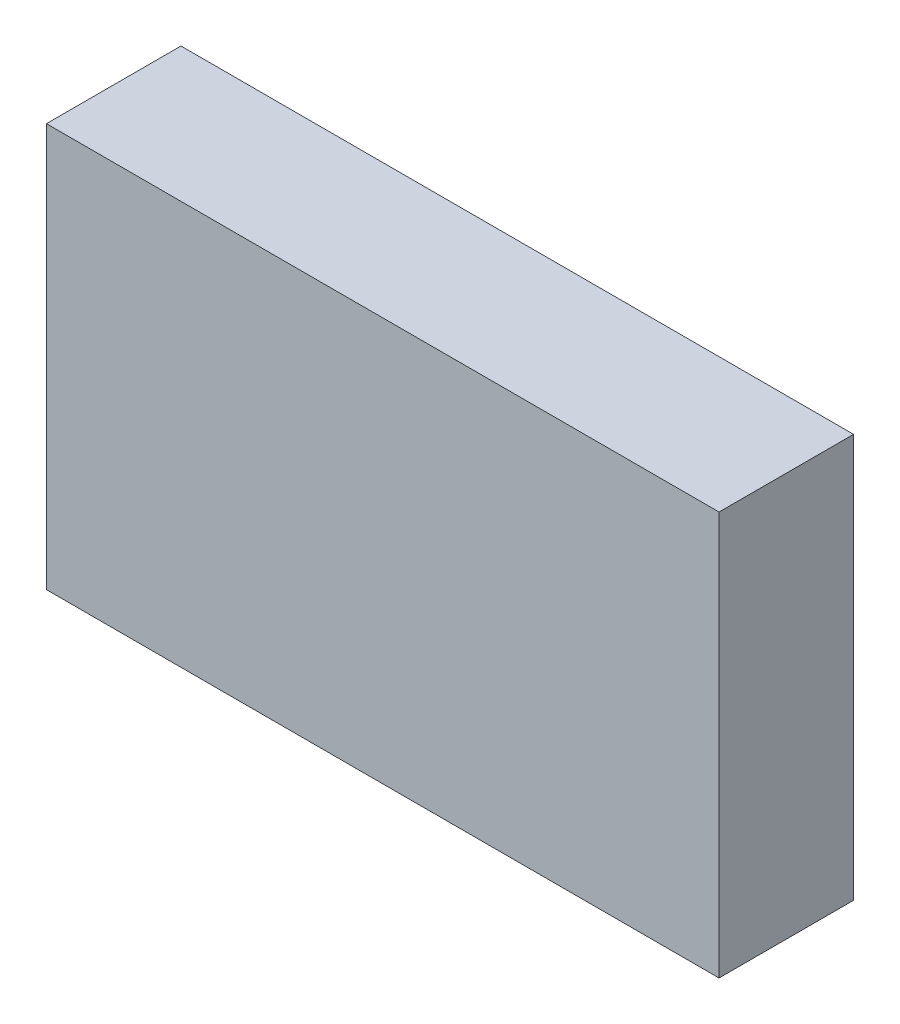
ISO-10303-21;
HEADER;
FILE_DESCRIPTION(('STEP AP214'),'2;1');
FILE_NAME('part.step','',(''),(''),'','','');
FILE_SCHEMA(('AUTOMOTIVE_DESIGN { 1 0 10303 214 1 1 1 1 }'));
ENDSEC;
DATA;
#1=APPLICATION_CONTEXT('core data for automotive mechanical design processes');
#2=APPLICATION_PROTOCOL_DEFINITION('international standard','automotive_design',2000,#1);
#3=PRODUCT_CONTEXT('',#1,'mechanical');
#4=PRODUCT('Part','Part','',(#3));
#5=PRODUCT_RELATED_PRODUCT_CATEGORY('part','',(#4));
#6=PRODUCT_DEFINITION_FORMATION('','',#4);
#7=PRODUCT_DEFINITION_CONTEXT('part definition',#1,'design');
#8=PRODUCT_DEFINITION('design','',#6,#7);
#9=PRODUCT_DEFINITION_SHAPE('','',#8);
#10=(LENGTH_UNIT() NAMED_UNIT(*) SI_UNIT(.MILLI.,.METRE.));
#11=(NAMED_UNIT(*) PLANE_ANGLE_UNIT() SI_UNIT($,.RADIAN.));
#12=(NAMED_UNIT(*) SI_UNIT($,.STERADIAN.) SOLID_ANGLE_UNIT());
#13=UNCERTAINTY_MEASURE_WITH_UNIT(LENGTH_MEASURE(1.E-05),#10,'distance_accuracy_value','');
#14=(GEOMETRIC_REPRESENTATION_CONTEXT(3) GLOBAL_UNCERTAINTY_ASSIGNED_CONTEXT((#13)) GLOBAL_UNIT_ASSIGNED_CONTEXT((#10,
#11,#12)) REPRESENTATION_CONTEXT('',''));
#15=CARTESIAN_POINT('',(0.,0.,0.));
#16=DIRECTION('',(0.,0.,1.));
#17=DIRECTION('',(1.,0.,0.));
#18=AXIS2_PLACEMENT_3D('',#15,#16,#17);
#19=CARTESIAN_POINT('',(0.,0.,20.));
#20=DIRECTION('',(1.,0.,0.));
#21=DIRECTION('',(0.,0.,-1.));
#22=AXIS2_PLACEMENT_3D('',#19,#20,#21);
#23=PLANE('',#22);
#24=DIRECTION('',(0.,-1.,0.));
#25=VECTOR('',#24,1.);
#26=CARTESIAN_POINT('',(0.,0.,0.));
#27=LINE('',#26,#25);
#28=CARTESIAN_POINT('',(0.,60.,0.));
#29=VERTEX_POINT('',#28);
#30=CARTESIAN_POINT('',(0.,0.,0.));
#31=VERTEX_POINT('',#30);
#32=EDGE_CURVE('E105',#29,#31,#27,.T.);
#33=ORIENTED_EDGE('',*,*,#32,.T.);
#34=DIRECTION('',(0.,0.,-1.));
#35=VECTOR('',#34,1.);
#36=CARTESIAN_POINT('',(0.,0.,20.));
#37=LINE('',#36,#35);
#38=CARTESIAN_POINT('',(0.,0.,20.));
#39=VERTEX_POINT('',#38);
#40=EDGE_CURVE('E11',#39,#31,#37,.T.);
#41=ORIENTED_EDGE('',*,*,#40,.F.);
#42=DIRECTION('',(0.,-1.,0.));
#43=VECTOR('',#42,1.);
#44=CARTESIAN_POINT('',(0.,0.,20.));
#45=LINE('',#44,#43);
#46=CARTESIAN_POINT('',(0.,60.,20.));
#47=VERTEX_POINT('',#46);
#48=EDGE_CURVE('E89',#47,#39,#45,.T.);
#49=ORIENTED_EDGE('',*,*,#48,.F.);
#50=DIRECTION('',(0.,0.,-1.));
#51=VECTOR('',#50,1.);
#52=CARTESIAN_POINT('',(0.,60.,20.));
#53=LINE('',#52,#51);
#54=EDGE_CURVE('E97',#47,#29,#53,.T.);
#55=ORIENTED_EDGE('',*,*,#54,.T.);
#56=EDGE_LOOP('',(#33,#41,#49,#55));
#57=FACE_BOUND('',#56,.T.);
#58=ADVANCED_FACE('F39',(#57),#23,.F.);
#59=CARTESIAN_POINT('',(0.,0.,20.));
#60=DIRECTION('',(0.,1.,0.));
#61=DIRECTION('',(0.,0.,1.));
#62=AXIS2_PLACEMENT_3D('',#59,#60,#61);
#63=PLANE('',#62);
#64=DIRECTION('',(1.,0.,0.));
#65=VECTOR('',#64,1.);
#66=CARTESIAN_POINT('',(0.,0.,0.));
#67=LINE('',#66,#65);
#68=CARTESIAN_POINT('',(100.,0.,0.));
#69=VERTEX_POINT('',#68);
#70=EDGE_CURVE('E92',#31,#69,#67,.T.);
#71=ORIENTED_EDGE('',*,*,#70,.T.);
#72=DIRECTION('',(0.,0.,-1.));
#73=VECTOR('',#72,1.);
#74=CARTESIAN_POINT('',(100.,0.,20.));
#75=LINE('',#74,#73);
#76=CARTESIAN_POINT('',(100.,0.,20.));
#77=VERTEX_POINT('',#76);
#78=EDGE_CURVE('E50',#77,#69,#75,.T.);
#79=ORIENTED_EDGE('',*,*,#78,.F.);
#80=DIRECTION('',(1.,0.,0.));
#81=VECTOR('',#80,1.);
#82=CARTESIAN_POINT('',(0.,0.,20.));
#83=LINE('',#82,#81);
#84=EDGE_CURVE('E82',#39,#77,#83,.T.);
#85=ORIENTED_EDGE('',*,*,#84,.F.);
#86=ORIENTED_EDGE('',*,*,#40,.T.);
#87=EDGE_LOOP('',(#71,#79,#85,#86));
#88=FACE_BOUND('',#87,.T.);
#89=ADVANCED_FACE('F93',(#88),#63,.F.);
#90=CARTESIAN_POINT('',(100.,0.,20.));
#91=DIRECTION('',(-1.,0.,0.));
#92=DIRECTION('',(0.,0.,1.));
#93=AXIS2_PLACEMENT_3D('',#90,#91,#92);
#94=PLANE('',#93);
#95=DIRECTION('',(0.,1.,0.));
#96=VECTOR('',#95,1.);
#97=CARTESIAN_POINT('',(100.,0.,0.));
#98=LINE('',#97,#96);
#99=CARTESIAN_POINT('',(100.,60.,0.));
#100=VERTEX_POINT('',#99);
#101=EDGE_CURVE('E72',#69,#100,#98,.T.);
#102=ORIENTED_EDGE('',*,*,#101,.T.);
#103=DIRECTION('',(0.,0.,-1.));
#104=VECTOR('',#103,1.);
#105=CARTESIAN_POINT('',(100.,60.,20.));
#106=LINE('',#105,#104);
#107=CARTESIAN_POINT('',(100.,60.,20.));
#108=VERTEX_POINT('',#107);
#109=EDGE_CURVE('E94',#108,#100,#106,.T.);
#110=ORIENTED_EDGE('',*,*,#109,.F.);
#111=DIRECTION('',(0.,1.,0.));
#112=VECTOR('',#111,1.);
#113=CARTESIAN_POINT('',(100.,0.,20.));
#114=LINE('',#113,#112);
#115=EDGE_CURVE('E88',#77,#108,#114,.T.);
#116=ORIENTED_EDGE('',*,*,#115,.F.);
#117=ORIENTED_EDGE('',*,*,#78,.T.);
#118=EDGE_LOOP('',(#102,#110,#116,#117));
#119=FACE_BOUND('',#118,.T.);
#120=ADVANCED_FACE('F96',(#119),#94,.F.);
#121=CARTESIAN_POINT('',(0.,60.,20.));
#122=DIRECTION('',(0.,-1.,0.));
#123=DIRECTION('',(0.,0.,-1.));
#124=AXIS2_PLACEMENT_3D('',#121,#122,#123);
#125=PLANE('',#124);
#126=DIRECTION('',(-1.,0.,0.));
#127=VECTOR('',#126,1.);
#128=CARTESIAN_POINT('',(0.,60.,0.));
#129=LINE('',#128,#127);
#130=EDGE_CURVE('E76',#100,#29,#129,.T.);
#131=ORIENTED_EDGE('',*,*,#130,.T.);
#132=ORIENTED_EDGE('',*,*,#54,.F.);
#133=DIRECTION('',(-1.,0.,0.));
#134=VECTOR('',#133,1.);
#135=CARTESIAN_POINT('',(0.,60.,20.));
#136=LINE('',#135,#134);
#137=EDGE_CURVE('E54',#108,#47,#136,.T.);
#138=ORIENTED_EDGE('',*,*,#137,.F.);
#139=ORIENTED_EDGE('',*,*,#109,.T.);
#140=EDGE_LOOP('',(#131,#132,#138,#139));
#141=FACE_BOUND('',#140,.T.);
#142=ADVANCED_FACE('F108',(#141),#125,.F.);
#143=CARTESIAN_POINT('',(0.,0.,20.));
#144=DIRECTION('',(0.,0.,-1.));
#145=DIRECTION('',(-1.,0.,0.));
#146=AXIS2_PLACEMENT_3D('',#143,#144,#145);
#147=PLANE('',#146);
#148=ORIENTED_EDGE('',*,*,#48,.T.);
#149=ORIENTED_EDGE('',*,*,#84,.T.);
#150=ORIENTED_EDGE('',*,*,#115,.T.);
#151=ORIENTED_EDGE('',*,*,#137,.T.);
#152=EDGE_LOOP('',(#148,#149,#150,#151));
#153=FACE_BOUND('',#152,.T.);
#154=ADVANCED_FACE('F86',(#153),#147,.F.);
#155=CARTESIAN_POINT('',(0.,0.,0.));
#156=DIRECTION('',(0.,0.,-1.));
#157=DIRECTION('',(-1.,0.,0.));
#158=AXIS2_PLACEMENT_3D('',#155,#156,#157);
#159=PLANE('',#158);
#160=ORIENTED_EDGE('',*,*,#32,.F.);
#161=ORIENTED_EDGE('',*,*,#130,.F.);
#162=ORIENTED_EDGE('',*,*,#101,.F.);
#163=ORIENTED_EDGE('',*,*,#70,.F.);
#164=EDGE_LOOP('',(#160,#161,#162,#163));
#165=FACE_BOUND('',#164,.T.);
#166=ADVANCED_FACE('F115',(#165),#159,.T.);
#167=CLOSED_SHELL('',(#58,#89,#120,#142,#154,#166));
#168=MANIFOLD_SOLID_BREP('B2',#167);
#169=ADVANCED_BREP_SHAPE_REPRESENTATION('',(#18,#168),#14);
#170=SHAPE_DEFINITION_REPRESENTATION(#9,#169);
ENDSEC;
END-ISO-10303-21;
